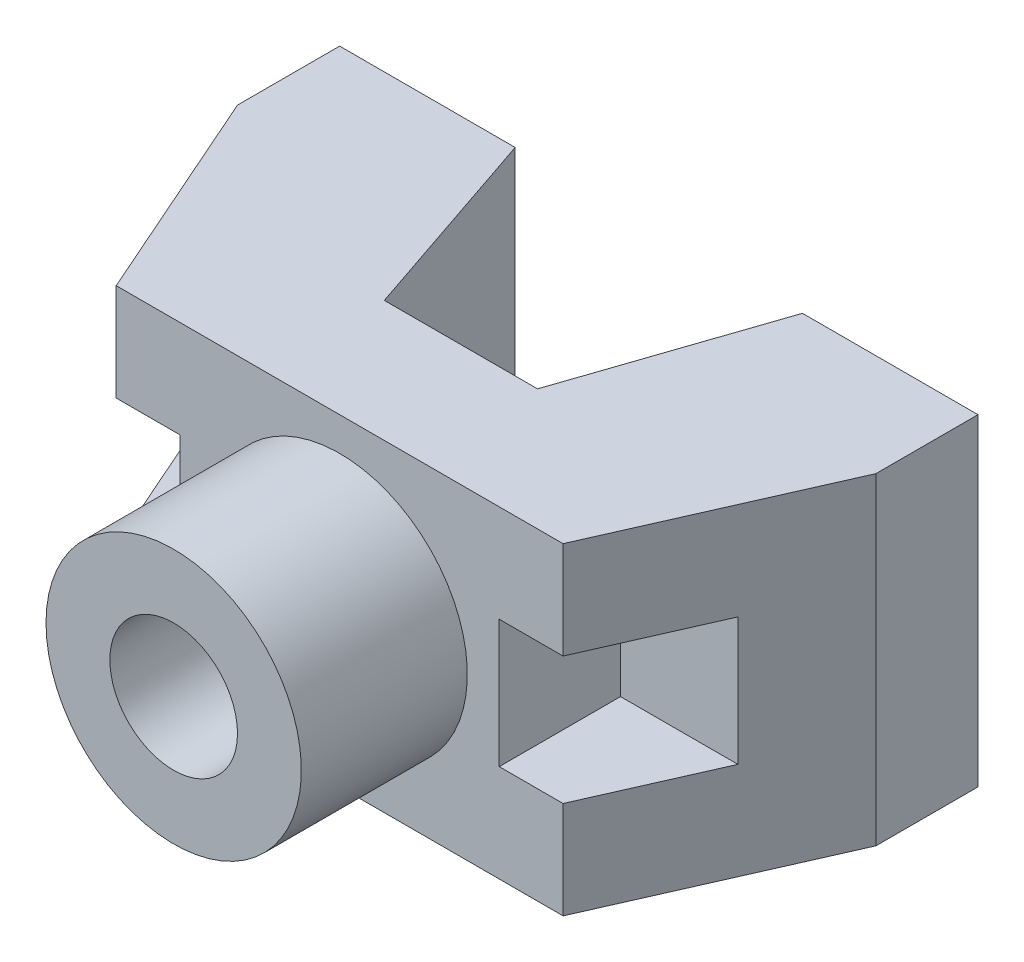
ISO-10303-21;
HEADER;
FILE_DESCRIPTION(('STEP AP214'),'2;1');
FILE_NAME('part.step','',(''),(''),'','','');
FILE_SCHEMA(('AUTOMOTIVE_DESIGN { 1 0 10303 214 1 1 1 1 }'));
ENDSEC;
DATA;
#1=APPLICATION_CONTEXT('core data for automotive mechanical design processes');
#2=APPLICATION_PROTOCOL_DEFINITION('international standard','automotive_design',2000,#1);
#3=PRODUCT_CONTEXT('',#1,'mechanical');
#4=PRODUCT('Part','Part','',(#3));
#5=PRODUCT_RELATED_PRODUCT_CATEGORY('part','',(#4));
#6=PRODUCT_DEFINITION_FORMATION('','',#4);
#7=PRODUCT_DEFINITION_CONTEXT('part definition',#1,'design');
#8=PRODUCT_DEFINITION('design','',#6,#7);
#9=PRODUCT_DEFINITION_SHAPE('','',#8);
#10=(LENGTH_UNIT() NAMED_UNIT(*) SI_UNIT(.MILLI.,.METRE.));
#11=(NAMED_UNIT(*) PLANE_ANGLE_UNIT() SI_UNIT($,.RADIAN.));
#12=(NAMED_UNIT(*) SI_UNIT($,.STERADIAN.) SOLID_ANGLE_UNIT());
#13=UNCERTAINTY_MEASURE_WITH_UNIT(LENGTH_MEASURE(1.E-05),#10,'distance_accuracy_value','');
#14=(GEOMETRIC_REPRESENTATION_CONTEXT(3) GLOBAL_UNCERTAINTY_ASSIGNED_CONTEXT((#13)) GLOBAL_UNIT_ASSIGNED_CONTEXT((#10,
#11,#12)) REPRESENTATION_CONTEXT('',''));
#15=CARTESIAN_POINT('',(0.,0.,0.));
#16=DIRECTION('',(0.,0.,1.));
#17=DIRECTION('',(1.,0.,0.));
#18=AXIS2_PLACEMENT_3D('',#15,#16,#17);
#19=CARTESIAN_POINT('',(0.,50.5,0.));
#20=DIRECTION('',(0.,0.,-1.));
#21=DIRECTION('',(-1.,0.,0.));
#22=AXIS2_PLACEMENT_3D('',#19,#20,#21);
#23=PLANE('',#22);
#24=CARTESIAN_POINT('',(35.,25.25,0.));
#25=DIRECTION('',(0.,0.,1.));
#26=DIRECTION('',(1.,0.,0.));
#27=AXIS2_PLACEMENT_3D('',#24,#25,#26);
#28=CIRCLE('',#27,20.);
#29=CARTESIAN_POINT('',(15.,25.25,0.));
#30=VERTEX_POINT('',#29);
#31=EDGE_CURVE('E223',#30,#30,#28,.T.);
#32=ORIENTED_EDGE('',*,*,#31,.F.);
#33=EDGE_LOOP('',(#32));
#34=FACE_BOUND('',#33,.T.);
#35=DIRECTION('',(1.,0.,0.));
#36=VECTOR('',#35,1.);
#37=CARTESIAN_POINT('',(10.,15.25,0.));
#38=LINE('',#37,#36);
#39=CARTESIAN_POINT('',(0.,15.25,0.));
#40=VERTEX_POINT('',#39);
#41=CARTESIAN_POINT('',(10.,15.25,0.));
#42=VERTEX_POINT('',#41);
#43=EDGE_CURVE('E206',#40,#42,#38,.T.);
#44=ORIENTED_EDGE('',*,*,#43,.F.);
#45=DIRECTION('',(0.,-1.,0.));
#46=VECTOR('',#45,1.);
#47=CARTESIAN_POINT('',(0.,50.5,0.));
#48=LINE('',#47,#46);
#49=CARTESIAN_POINT('',(0.,0.,0.));
#50=VERTEX_POINT('',#49);
#51=EDGE_CURVE('E282',#40,#50,#48,.T.);
#52=ORIENTED_EDGE('',*,*,#51,.T.);
#53=DIRECTION('',(1.,0.,0.));
#54=VECTOR('',#53,1.);
#55=CARTESIAN_POINT('',(0.,0.,0.));
#56=LINE('',#55,#54);
#57=CARTESIAN_POINT('',(70.,0.,0.));
#58=VERTEX_POINT('',#57);
#59=EDGE_CURVE('E277',#50,#58,#56,.T.);
#60=ORIENTED_EDGE('',*,*,#59,.T.);
#61=DIRECTION('',(0.,-1.,0.));
#62=VECTOR('',#61,1.);
#63=CARTESIAN_POINT('',(70.,50.5,0.));
#64=LINE('',#63,#62);
#65=CARTESIAN_POINT('',(70.,15.25,0.));
#66=VERTEX_POINT('',#65);
#67=EDGE_CURVE('E288',#66,#58,#64,.T.);
#68=ORIENTED_EDGE('',*,*,#67,.F.);
#69=DIRECTION('',(1.,0.,0.));
#70=VECTOR('',#69,1.);
#71=CARTESIAN_POINT('',(60.,15.25,0.));
#72=LINE('',#71,#70);
#73=CARTESIAN_POINT('',(60.,15.25,0.));
#74=VERTEX_POINT('',#73);
#75=EDGE_CURVE('E172',#74,#66,#72,.T.);
#76=ORIENTED_EDGE('',*,*,#75,.F.);
#77=DIRECTION('',(0.,-1.,0.));
#78=VECTOR('',#77,1.);
#79=CARTESIAN_POINT('',(60.,35.25,0.));
#80=LINE('',#79,#78);
#81=CARTESIAN_POINT('',(60.,35.25,0.));
#82=VERTEX_POINT('',#81);
#83=EDGE_CURVE('E195',#82,#74,#80,.T.);
#84=ORIENTED_EDGE('',*,*,#83,.F.);
#85=DIRECTION('',(-1.,0.,0.));
#86=VECTOR('',#85,1.);
#87=CARTESIAN_POINT('',(80.,35.25,0.));
#88=LINE('',#87,#86);
#89=CARTESIAN_POINT('',(70.,35.25,0.));
#90=VERTEX_POINT('',#89);
#91=EDGE_CURVE('E182',#90,#82,#88,.T.);
#92=ORIENTED_EDGE('',*,*,#91,.F.);
#93=CARTESIAN_POINT('',(70.,50.5,0.));
#94=VERTEX_POINT('',#93);
#95=EDGE_CURVE('E286',#94,#90,#64,.T.);
#96=ORIENTED_EDGE('',*,*,#95,.F.);
#97=DIRECTION('',(1.,0.,0.));
#98=VECTOR('',#97,1.);
#99=CARTESIAN_POINT('',(0.,50.5,0.));
#100=LINE('',#99,#98);
#101=CARTESIAN_POINT('',(0.,50.5,0.));
#102=VERTEX_POINT('',#101);
#103=EDGE_CURVE('E249',#102,#94,#100,.T.);
#104=ORIENTED_EDGE('',*,*,#103,.F.);
#105=CARTESIAN_POINT('',(0.,35.25,0.));
#106=VERTEX_POINT('',#105);
#107=EDGE_CURVE('E281',#102,#106,#48,.T.);
#108=ORIENTED_EDGE('',*,*,#107,.T.);
#109=DIRECTION('',(-1.,0.,0.));
#110=VECTOR('',#109,1.);
#111=CARTESIAN_POINT('',(-9.99999999999999,35.25,0.));
#112=LINE('',#111,#110);
#113=CARTESIAN_POINT('',(10.,35.25,0.));
#114=VERTEX_POINT('',#113);
#115=EDGE_CURVE('E205',#114,#106,#112,.T.);
#116=ORIENTED_EDGE('',*,*,#115,.F.);
#117=DIRECTION('',(0.,1.,0.));
#118=VECTOR('',#117,1.);
#119=CARTESIAN_POINT('',(10.,35.25,0.));
#120=LINE('',#119,#118);
#121=EDGE_CURVE('E192',#42,#114,#120,.T.);
#122=ORIENTED_EDGE('',*,*,#121,.F.);
#123=EDGE_LOOP('',(#44,#52,#60,#68,#76,#84,#92,#96,#104,#108,#116,#122));
#124=FACE_BOUND('',#123,.T.);
#125=ADVANCED_FACE('F41',(#34,#124),#23,.F.);
#126=CARTESIAN_POINT('',(-15.,50.5,-34.));
#127=DIRECTION('',(-1.,0.,0.));
#128=DIRECTION('',(0.,0.,1.));
#129=AXIS2_PLACEMENT_3D('',#126,#127,#128);
#130=PLANE('',#129);
#131=DIRECTION('',(0.,0.,-1.));
#132=VECTOR('',#131,1.);
#133=CARTESIAN_POINT('',(-15.,0.,-34.));
#134=LINE('',#133,#132);
#135=CARTESIAN_POINT('',(-15.,0.,-34.));
#136=VERTEX_POINT('',#135);
#137=CARTESIAN_POINT('',(-15.,0.,-50.));
#138=VERTEX_POINT('',#137);
#139=EDGE_CURVE('E221',#136,#138,#134,.T.);
#140=ORIENTED_EDGE('',*,*,#139,.F.);
#141=DIRECTION('',(0.,-1.,0.));
#142=VECTOR('',#141,1.);
#143=CARTESIAN_POINT('',(-15.,50.5,-34.));
#144=LINE('',#143,#142);
#145=CARTESIAN_POINT('',(-15.,50.5,-34.));
#146=VERTEX_POINT('',#145);
#147=EDGE_CURVE('E230',#146,#136,#144,.T.);
#148=ORIENTED_EDGE('',*,*,#147,.F.);
#149=DIRECTION('',(0.,0.,-1.));
#150=VECTOR('',#149,1.);
#151=CARTESIAN_POINT('',(-15.,50.5,-34.));
#152=LINE('',#151,#150);
#153=CARTESIAN_POINT('',(-15.,50.5,-50.));
#154=VERTEX_POINT('',#153);
#155=EDGE_CURVE('E228',#146,#154,#152,.T.);
#156=ORIENTED_EDGE('',*,*,#155,.T.);
#157=DIRECTION('',(0.,-1.,0.));
#158=VECTOR('',#157,1.);
#159=CARTESIAN_POINT('',(-15.,50.5,-50.));
#160=LINE('',#159,#158);
#161=EDGE_CURVE('E254',#154,#138,#160,.T.);
#162=ORIENTED_EDGE('',*,*,#161,.T.);
#163=EDGE_LOOP('',(#140,#148,#156,#162));
#164=FACE_BOUND('',#163,.T.);
#165=ADVANCED_FACE('F43',(#164),#130,.T.);
#166=CARTESIAN_POINT('',(0.,50.5,0.));
#167=DIRECTION('',(-0.914917801572932,0.,0.403640206576293));
#168=DIRECTION('',(0.403640206576294,0.,0.914917801572932));
#169=AXIS2_PLACEMENT_3D('',#166,#167,#168);
#170=PLANE('',#169);
#171=DIRECTION('',(-0.403640206576294,0.,-0.914917801572932));
#172=VECTOR('',#171,1.);
#173=CARTESIAN_POINT('',(0.,35.25,0.));
#174=LINE('',#173,#172);
#175=CARTESIAN_POINT('',(-8.38235294117647,35.25,-19.));
#176=VERTEX_POINT('',#175);
#177=EDGE_CURVE('E11',#106,#176,#174,.T.);
#178=ORIENTED_EDGE('',*,*,#177,.F.);
#179=ORIENTED_EDGE('',*,*,#107,.F.);
#180=DIRECTION('',(-0.403640206576294,0.,-0.914917801572932));
#181=VECTOR('',#180,1.);
#182=CARTESIAN_POINT('',(0.,50.5,0.));
#183=LINE('',#182,#181);
#184=EDGE_CURVE('E252',#102,#146,#183,.T.);
#185=ORIENTED_EDGE('',*,*,#184,.T.);
#186=ORIENTED_EDGE('',*,*,#147,.T.);
#187=DIRECTION('',(-0.403640206576294,0.,-0.914917801572932));
#188=VECTOR('',#187,1.);
#189=CARTESIAN_POINT('',(0.,0.,0.));
#190=LINE('',#189,#188);
#191=EDGE_CURVE('E232',#50,#136,#190,.T.);
#192=ORIENTED_EDGE('',*,*,#191,.F.);
#193=ORIENTED_EDGE('',*,*,#51,.F.);
#194=DIRECTION('',(0.403640206576294,0.,0.914917801572932));
#195=VECTOR('',#194,1.);
#196=CARTESIAN_POINT('',(0.,15.25,0.));
#197=LINE('',#196,#195);
#198=CARTESIAN_POINT('',(-8.38235294117647,15.25,-19.));
#199=VERTEX_POINT('',#198);
#200=EDGE_CURVE('E47',#199,#40,#197,.T.);
#201=ORIENTED_EDGE('',*,*,#200,.F.);
#202=DIRECTION('',(0.,-1.,0.));
#203=VECTOR('',#202,1.);
#204=CARTESIAN_POINT('',(-8.38235294117647,50.5,-19.));
#205=LINE('',#204,#203);
#206=EDGE_CURVE('E208',#176,#199,#205,.T.);
#207=ORIENTED_EDGE('',*,*,#206,.F.);
#208=EDGE_LOOP('',(#178,#179,#185,#186,#192,#193,#201,#207));
#209=FACE_BOUND('',#208,.T.);
#210=ADVANCED_FACE('F324',(#209),#170,.T.);
#211=CARTESIAN_POINT('',(70.,50.5,0.));
#212=DIRECTION('',(-0.914917801572932,0.,-0.403640206576293));
#213=DIRECTION('',(-0.403640206576294,0.,0.914917801572932));
#214=AXIS2_PLACEMENT_3D('',#211,#212,#213);
#215=PLANE('',#214);
#216=DIRECTION('',(0.,1.,0.));
#217=VECTOR('',#216,1.);
#218=CARTESIAN_POINT('',(78.3823529411765,50.5,-19.));
#219=LINE('',#218,#217);
#220=CARTESIAN_POINT('',(78.3823529411765,15.25,-19.));
#221=VERTEX_POINT('',#220);
#222=CARTESIAN_POINT('',(78.3823529411765,35.25,-19.));
#223=VERTEX_POINT('',#222);
#224=EDGE_CURVE('E171',#221,#223,#219,.T.);
#225=ORIENTED_EDGE('',*,*,#224,.F.);
#226=DIRECTION('',(-0.403640206576294,0.,0.914917801572932));
#227=VECTOR('',#226,1.);
#228=CARTESIAN_POINT('',(70.,15.25,0.));
#229=LINE('',#228,#227);
#230=EDGE_CURVE('E207',#221,#66,#229,.T.);
#231=ORIENTED_EDGE('',*,*,#230,.T.);
#232=ORIENTED_EDGE('',*,*,#67,.T.);
#233=DIRECTION('',(0.403640206576294,0.,-0.914917801572932));
#234=VECTOR('',#233,1.);
#235=CARTESIAN_POINT('',(70.,0.,0.));
#236=LINE('',#235,#234);
#237=CARTESIAN_POINT('',(85.,0.,-34.));
#238=VERTEX_POINT('',#237);
#239=EDGE_CURVE('E273',#58,#238,#236,.T.);
#240=ORIENTED_EDGE('',*,*,#239,.T.);
#241=DIRECTION('',(0.,-1.,0.));
#242=VECTOR('',#241,1.);
#243=CARTESIAN_POINT('',(85.,50.5,-34.));
#244=LINE('',#243,#242);
#245=CARTESIAN_POINT('',(85.,50.5,-34.));
#246=VERTEX_POINT('',#245);
#247=EDGE_CURVE('E289',#246,#238,#244,.T.);
#248=ORIENTED_EDGE('',*,*,#247,.F.);
#249=DIRECTION('',(0.403640206576294,0.,-0.914917801572932));
#250=VECTOR('',#249,1.);
#251=CARTESIAN_POINT('',(70.,50.5,0.));
#252=LINE('',#251,#250);
#253=EDGE_CURVE('E247',#94,#246,#252,.T.);
#254=ORIENTED_EDGE('',*,*,#253,.F.);
#255=ORIENTED_EDGE('',*,*,#95,.T.);
#256=DIRECTION('',(0.403640206576294,0.,-0.914917801572932));
#257=VECTOR('',#256,1.);
#258=CARTESIAN_POINT('',(70.,35.25,0.));
#259=LINE('',#258,#257);
#260=EDGE_CURVE('E307',#90,#223,#259,.T.);
#261=ORIENTED_EDGE('',*,*,#260,.T.);
#262=EDGE_LOOP('',(#225,#231,#232,#240,#248,#254,#255,#261));
#263=FACE_BOUND('',#262,.T.);
#264=ADVANCED_FACE('F331',(#263),#215,.F.);
#265=CARTESIAN_POINT('',(85.,50.5,-34.));
#266=DIRECTION('',(-1.,0.,0.));
#267=DIRECTION('',(0.,0.,1.));
#268=AXIS2_PLACEMENT_3D('',#265,#266,#267);
#269=PLANE('',#268);
#270=DIRECTION('',(0.,0.,-1.));
#271=VECTOR('',#270,1.);
#272=CARTESIAN_POINT('',(85.,0.,-34.));
#273=LINE('',#272,#271);
#274=CARTESIAN_POINT('',(85.,0.,-50.));
#275=VERTEX_POINT('',#274);
#276=EDGE_CURVE('E275',#238,#275,#273,.T.);
#277=ORIENTED_EDGE('',*,*,#276,.T.);
#278=DIRECTION('',(0.,-1.,0.));
#279=VECTOR('',#278,1.);
#280=CARTESIAN_POINT('',(85.,50.5,-50.));
#281=LINE('',#280,#279);
#282=CARTESIAN_POINT('',(85.,50.5,-50.));
#283=VERTEX_POINT('',#282);
#284=EDGE_CURVE('E291',#283,#275,#281,.T.);
#285=ORIENTED_EDGE('',*,*,#284,.F.);
#286=DIRECTION('',(0.,0.,-1.));
#287=VECTOR('',#286,1.);
#288=CARTESIAN_POINT('',(85.,50.5,-34.));
#289=LINE('',#288,#287);
#290=EDGE_CURVE('E246',#246,#283,#289,.T.);
#291=ORIENTED_EDGE('',*,*,#290,.F.);
#292=ORIENTED_EDGE('',*,*,#247,.T.);
#293=EDGE_LOOP('',(#277,#285,#291,#292));
#294=FACE_BOUND('',#293,.T.);
#295=ADVANCED_FACE('F376',(#294),#269,.F.);
#296=CARTESIAN_POINT('',(85.,50.5,-50.));
#297=DIRECTION('',(0.,0.,1.));
#298=DIRECTION('',(1.,0.,0.));
#299=AXIS2_PLACEMENT_3D('',#296,#297,#298);
#300=PLANE('',#299);
#301=DIRECTION('',(-1.,0.,0.));
#302=VECTOR('',#301,1.);
#303=CARTESIAN_POINT('',(85.,0.,-50.));
#304=LINE('',#303,#302);
#305=CARTESIAN_POINT('',(57.5,0.,-50.));
#306=VERTEX_POINT('',#305);
#307=EDGE_CURVE('E269',#275,#306,#304,.T.);
#308=ORIENTED_EDGE('',*,*,#307,.T.);
#309=DIRECTION('',(0.,-1.,0.));
#310=VECTOR('',#309,1.);
#311=CARTESIAN_POINT('',(57.5,50.5,-50.));
#312=LINE('',#311,#310);
#313=CARTESIAN_POINT('',(57.5,50.5,-50.));
#314=VERTEX_POINT('',#313);
#315=EDGE_CURVE('E299',#314,#306,#312,.T.);
#316=ORIENTED_EDGE('',*,*,#315,.F.);
#317=DIRECTION('',(-1.,0.,0.));
#318=VECTOR('',#317,1.);
#319=CARTESIAN_POINT('',(85.,50.5,-50.));
#320=LINE('',#319,#318);
#321=EDGE_CURVE('E243',#283,#314,#320,.T.);
#322=ORIENTED_EDGE('',*,*,#321,.F.);
#323=ORIENTED_EDGE('',*,*,#284,.T.);
#324=EDGE_LOOP('',(#308,#316,#322,#323));
#325=FACE_BOUND('',#324,.T.);
#326=ADVANCED_FACE('F377',(#325),#300,.F.);
#327=CARTESIAN_POINT('',(57.5,50.5,-50.));
#328=DIRECTION('',(0.947144575627813,0.,0.320807033680389));
#329=DIRECTION('',(0.320807033680389,0.,-0.947144575627813));
#330=AXIS2_PLACEMENT_3D('',#327,#328,#329);
#331=PLANE('',#330);
#332=DIRECTION('',(-0.320807033680389,0.,0.947144575627813));
#333=VECTOR('',#332,1.);
#334=CARTESIAN_POINT('',(57.5,0.,-50.));
#335=LINE('',#334,#333);
#336=CARTESIAN_POINT('',(47.,0.,-19.));
#337=VERTEX_POINT('',#336);
#338=EDGE_CURVE('E270',#306,#337,#335,.T.);
#339=ORIENTED_EDGE('',*,*,#338,.T.);
#340=DIRECTION('',(0.,-1.,0.));
#341=VECTOR('',#340,1.);
#342=CARTESIAN_POINT('',(47.,50.5,-19.));
#343=LINE('',#342,#341);
#344=CARTESIAN_POINT('',(47.,50.5,-19.));
#345=VERTEX_POINT('',#344);
#346=EDGE_CURVE('E298',#345,#337,#343,.T.);
#347=ORIENTED_EDGE('',*,*,#346,.F.);
#348=DIRECTION('',(-0.320807033680389,0.,0.947144575627813));
#349=VECTOR('',#348,1.);
#350=CARTESIAN_POINT('',(57.5,50.5,-50.));
#351=LINE('',#350,#349);
#352=EDGE_CURVE('E241',#314,#345,#351,.T.);
#353=ORIENTED_EDGE('',*,*,#352,.F.);
#354=ORIENTED_EDGE('',*,*,#315,.T.);
#355=EDGE_LOOP('',(#339,#347,#353,#354));
#356=FACE_BOUND('',#355,.T.);
#357=ADVANCED_FACE('F382',(#356),#331,.F.);
#358=CARTESIAN_POINT('',(23.,50.5,-19.));
#359=DIRECTION('',(0.,0.,-1.));
#360=DIRECTION('',(-1.,0.,0.));
#361=AXIS2_PLACEMENT_3D('',#358,#359,#360);
#362=PLANE('',#361);
#363=DIRECTION('',(1.,0.,0.));
#364=VECTOR('',#363,1.);
#365=CARTESIAN_POINT('',(23.,0.,-19.));
#366=LINE('',#365,#364);
#367=CARTESIAN_POINT('',(23.,0.,-19.));
#368=VERTEX_POINT('',#367);
#369=EDGE_CURVE('E262',#368,#337,#366,.T.);
#370=ORIENTED_EDGE('',*,*,#369,.F.);
#371=DIRECTION('',(0.,-1.,0.));
#372=VECTOR('',#371,1.);
#373=CARTESIAN_POINT('',(23.,50.5,-19.));
#374=LINE('',#373,#372);
#375=CARTESIAN_POINT('',(23.,50.5,-19.));
#376=VERTEX_POINT('',#375);
#377=EDGE_CURVE('E301',#376,#368,#374,.T.);
#378=ORIENTED_EDGE('',*,*,#377,.F.);
#379=DIRECTION('',(1.,0.,0.));
#380=VECTOR('',#379,1.);
#381=CARTESIAN_POINT('',(23.,50.5,-19.));
#382=LINE('',#381,#380);
#383=EDGE_CURVE('E239',#376,#345,#382,.T.);
#384=ORIENTED_EDGE('',*,*,#383,.T.);
#385=ORIENTED_EDGE('',*,*,#346,.T.);
#386=EDGE_LOOP('',(#370,#378,#384,#385));
#387=FACE_BOUND('',#386,.T.);
#388=ADVANCED_FACE('F390',(#387),#362,.T.);
#389=CARTESIAN_POINT('',(12.5,50.5,-50.));
#390=DIRECTION('',(0.947144575627813,0.,-0.320807033680388));
#391=DIRECTION('',(-0.320807033680388,0.,-0.947144575627813));
#392=AXIS2_PLACEMENT_3D('',#389,#390,#391);
#393=PLANE('',#392);
#394=DIRECTION('',(0.320807033680388,0.,0.947144575627813));
#395=VECTOR('',#394,1.);
#396=CARTESIAN_POINT('',(12.5,0.,-50.));
#397=LINE('',#396,#395);
#398=CARTESIAN_POINT('',(12.5,0.,-50.));
#399=VERTEX_POINT('',#398);
#400=EDGE_CURVE('E261',#399,#368,#397,.T.);
#401=ORIENTED_EDGE('',*,*,#400,.F.);
#402=DIRECTION('',(0.,-1.,0.));
#403=VECTOR('',#402,1.);
#404=CARTESIAN_POINT('',(12.5,50.5,-50.));
#405=LINE('',#404,#403);
#406=CARTESIAN_POINT('',(12.5,50.5,-50.));
#407=VERTEX_POINT('',#406);
#408=EDGE_CURVE('E302',#407,#399,#405,.T.);
#409=ORIENTED_EDGE('',*,*,#408,.F.);
#410=DIRECTION('',(0.320807033680388,0.,0.947144575627813));
#411=VECTOR('',#410,1.);
#412=CARTESIAN_POINT('',(12.5,50.5,-50.));
#413=LINE('',#412,#411);
#414=EDGE_CURVE('E237',#407,#376,#413,.T.);
#415=ORIENTED_EDGE('',*,*,#414,.T.);
#416=ORIENTED_EDGE('',*,*,#377,.T.);
#417=EDGE_LOOP('',(#401,#409,#415,#416));
#418=FACE_BOUND('',#417,.T.);
#419=ADVANCED_FACE('F394',(#418),#393,.T.);
#420=CARTESIAN_POINT('',(-15.,50.5,-50.));
#421=DIRECTION('',(0.,0.,-1.));
#422=DIRECTION('',(-1.,0.,0.));
#423=AXIS2_PLACEMENT_3D('',#420,#421,#422);
#424=PLANE('',#423);
#425=DIRECTION('',(1.,0.,0.));
#426=VECTOR('',#425,1.);
#427=CARTESIAN_POINT('',(-15.,0.,-50.));
#428=LINE('',#427,#426);
#429=EDGE_CURVE('E256',#138,#399,#428,.T.);
#430=ORIENTED_EDGE('',*,*,#429,.F.);
#431=ORIENTED_EDGE('',*,*,#161,.F.);
#432=DIRECTION('',(1.,0.,0.));
#433=VECTOR('',#432,1.);
#434=CARTESIAN_POINT('',(-15.,50.5,-50.));
#435=LINE('',#434,#433);
#436=EDGE_CURVE('E235',#154,#407,#435,.T.);
#437=ORIENTED_EDGE('',*,*,#436,.T.);
#438=ORIENTED_EDGE('',*,*,#408,.T.);
#439=EDGE_LOOP('',(#430,#431,#437,#438));
#440=FACE_BOUND('',#439,.T.);
#441=ADVANCED_FACE('F393',(#440),#424,.T.);
#442=CARTESIAN_POINT('',(0.,50.5,0.));
#443=DIRECTION('',(0.,-1.,0.));
#444=DIRECTION('',(0.,0.,-1.));
#445=AXIS2_PLACEMENT_3D('',#442,#443,#444);
#446=PLANE('',#445);
#447=ORIENTED_EDGE('',*,*,#155,.F.);
#448=ORIENTED_EDGE('',*,*,#184,.F.);
#449=ORIENTED_EDGE('',*,*,#103,.T.);
#450=ORIENTED_EDGE('',*,*,#253,.T.);
#451=ORIENTED_EDGE('',*,*,#290,.T.);
#452=ORIENTED_EDGE('',*,*,#321,.T.);
#453=ORIENTED_EDGE('',*,*,#352,.T.);
#454=ORIENTED_EDGE('',*,*,#383,.F.);
#455=ORIENTED_EDGE('',*,*,#414,.F.);
#456=ORIENTED_EDGE('',*,*,#436,.F.);
#457=EDGE_LOOP('',(#447,#448,#449,#450,#451,#452,#453,#454,#455,#456));
#458=FACE_BOUND('',#457,.T.);
#459=ADVANCED_FACE('F343',(#458),#446,.F.);
#460=CARTESIAN_POINT('',(0.,0.,0.));
#461=DIRECTION('',(0.,-1.,0.));
#462=DIRECTION('',(0.,0.,-1.));
#463=AXIS2_PLACEMENT_3D('',#460,#461,#462);
#464=PLANE('',#463);
#465=ORIENTED_EDGE('',*,*,#139,.T.);
#466=ORIENTED_EDGE('',*,*,#429,.T.);
#467=ORIENTED_EDGE('',*,*,#400,.T.);
#468=ORIENTED_EDGE('',*,*,#369,.T.);
#469=ORIENTED_EDGE('',*,*,#338,.F.);
#470=ORIENTED_EDGE('',*,*,#307,.F.);
#471=ORIENTED_EDGE('',*,*,#276,.F.);
#472=ORIENTED_EDGE('',*,*,#239,.F.);
#473=ORIENTED_EDGE('',*,*,#59,.F.);
#474=ORIENTED_EDGE('',*,*,#191,.T.);
#475=EDGE_LOOP('',(#465,#466,#467,#468,#469,#470,#471,#472,#473,#474));
#476=FACE_BOUND('',#475,.T.);
#477=ADVANCED_FACE('F327',(#476),#464,.T.);
#478=CARTESIAN_POINT('',(35.,25.25,26.));
#479=DIRECTION('',(0.,0.,-1.));
#480=DIRECTION('',(-1.,0.,0.));
#481=AXIS2_PLACEMENT_3D('',#478,#479,#480);
#482=CYLINDRICAL_SURFACE('',#481,20.);
#483=CARTESIAN_POINT('',(35.,25.25,26.));
#484=DIRECTION('',(0.,0.,1.));
#485=DIRECTION('',(1.,0.,0.));
#486=AXIS2_PLACEMENT_3D('',#483,#484,#485);
#487=CIRCLE('',#486,20.);
#488=CARTESIAN_POINT('',(15.,25.25,26.));
#489=VERTEX_POINT('',#488);
#490=EDGE_CURVE('E218',#489,#489,#487,.T.);
#491=CARTESIAN_POINT('',(15.,25.25,26.));
#492=CARTESIAN_POINT('',(15.,25.25,25.7291666666667));
#493=CARTESIAN_POINT('',(15.,25.25,25.4583333333333));
#494=CARTESIAN_POINT('',(15.,25.25,24.9166666666667));
#495=CARTESIAN_POINT('',(15.,25.25,24.6458333333333));
#496=CARTESIAN_POINT('',(15.,25.25,24.1041666666667));
#497=CARTESIAN_POINT('',(15.,25.25,23.8333333333333));
#498=CARTESIAN_POINT('',(15.,25.25,23.2916666666667));
#499=CARTESIAN_POINT('',(15.,25.25,23.0208333333333));
#500=CARTESIAN_POINT('',(15.,25.25,22.4791666666667));
#501=CARTESIAN_POINT('',(15.,25.25,22.2083333333333));
#502=CARTESIAN_POINT('',(15.,25.25,21.6666666666667));
#503=CARTESIAN_POINT('',(15.,25.25,21.3958333333333));
#504=CARTESIAN_POINT('',(15.,25.25,20.8541666666667));
#505=CARTESIAN_POINT('',(15.,25.25,20.5833333333333));
#506=CARTESIAN_POINT('',(15.,25.25,20.0416666666667));
#507=CARTESIAN_POINT('',(15.,25.25,19.7708333333333));
#508=CARTESIAN_POINT('',(15.,25.25,19.2291666666667));
#509=CARTESIAN_POINT('',(15.,25.25,18.9583333333333));
#510=CARTESIAN_POINT('',(15.,25.25,18.4166666666667));
#511=CARTESIAN_POINT('',(15.,25.25,18.1458333333333));
#512=CARTESIAN_POINT('',(15.,25.25,17.6041666666667));
#513=CARTESIAN_POINT('',(15.,25.25,17.3333333333333));
#514=CARTESIAN_POINT('',(15.,25.25,16.7916666666667));
#515=CARTESIAN_POINT('',(15.,25.25,16.5208333333333));
#516=CARTESIAN_POINT('',(15.,25.25,15.9791666666667));
#517=CARTESIAN_POINT('',(15.,25.25,15.7083333333333));
#518=CARTESIAN_POINT('',(15.,25.25,15.1666666666667));
#519=CARTESIAN_POINT('',(15.,25.25,14.8958333333333));
#520=CARTESIAN_POINT('',(15.,25.25,14.3541666666667));
#521=CARTESIAN_POINT('',(15.,25.25,14.0833333333333));
#522=CARTESIAN_POINT('',(15.,25.25,13.5416666666667));
#523=CARTESIAN_POINT('',(15.,25.25,13.2708333333333));
#524=CARTESIAN_POINT('',(15.,25.25,12.7291666666667));
#525=CARTESIAN_POINT('',(15.,25.25,12.4583333333333));
#526=CARTESIAN_POINT('',(15.,25.25,11.9166666666667));
#527=CARTESIAN_POINT('',(15.,25.25,11.6458333333333));
#528=CARTESIAN_POINT('',(15.,25.25,11.1041666666667));
#529=CARTESIAN_POINT('',(15.,25.25,10.8333333333333));
#530=CARTESIAN_POINT('',(15.,25.25,10.2916666666667));
#531=CARTESIAN_POINT('',(15.,25.25,10.0208333333333));
#532=CARTESIAN_POINT('',(15.,25.25,9.47916666666667));
#533=CARTESIAN_POINT('',(15.,25.25,9.20833333333333));
#534=CARTESIAN_POINT('',(15.,25.25,8.66666666666667));
#535=CARTESIAN_POINT('',(15.,25.25,8.39583333333333));
#536=CARTESIAN_POINT('',(15.,25.25,7.85416666666667));
#537=CARTESIAN_POINT('',(15.,25.25,7.58333333333333));
#538=CARTESIAN_POINT('',(15.,25.25,7.04166666666667));
#539=CARTESIAN_POINT('',(15.,25.25,6.77083333333333));
#540=CARTESIAN_POINT('',(15.,25.25,6.22916666666667));
#541=CARTESIAN_POINT('',(15.,25.25,5.95833333333333));
#542=CARTESIAN_POINT('',(15.,25.25,5.41666666666667));
#543=CARTESIAN_POINT('',(15.,25.25,5.14583333333333));
#544=CARTESIAN_POINT('',(15.,25.25,4.60416666666667));
#545=CARTESIAN_POINT('',(15.,25.25,4.33333333333333));
#546=CARTESIAN_POINT('',(15.,25.25,3.79166666666667));
#547=CARTESIAN_POINT('',(15.,25.25,3.52083333333333));
#548=CARTESIAN_POINT('',(15.,25.25,2.97916666666667));
#549=CARTESIAN_POINT('',(15.,25.25,2.70833333333333));
#550=CARTESIAN_POINT('',(15.,25.25,2.16666666666667));
#551=CARTESIAN_POINT('',(15.,25.25,1.89583333333333));
#552=CARTESIAN_POINT('',(15.,25.25,1.35416666666667));
#553=CARTESIAN_POINT('',(15.,25.25,1.08333333333333));
#554=CARTESIAN_POINT('',(15.,25.25,0.541666666666667));
#555=CARTESIAN_POINT('',(15.,25.25,0.270833333333334));
#556=CARTESIAN_POINT('',(15.,25.25,0.));
#557=B_SPLINE_CURVE_WITH_KNOTS('',3,(#491,#492,#493,#494,#495,#496,#497,#498,#499,#500,#501,
#502,#503,#504,#505,#506,#507,#508,#509,#510,#511,#512,#513,#514,#515,#516,#517,#518,#519,#520,
#521,#522,#523,#524,#525,#526,#527,#528,#529,#530,#531,#532,#533,#534,#535,#536,#537,#538,#539,
#540,#541,#542,#543,#544,#545,#546,#547,#548,#549,#550,#551,#552,#553,#554,#555,#556),
.UNSPECIFIED.,.F.,.F.,(4,2,2,2,2,2,2,2,2,2,2,2,2,2,2,2,2,2,2,2,2,2,2,2,2,2,2,2,2,2,2,2,4),(0.,
0.812500000000001,1.625,2.4375,3.25,4.0625,4.875,5.6875,6.5,7.3125,8.125,8.9375,9.75,10.5625,
11.375,12.1875,13.,13.8125,14.625,15.4375,16.25,17.0625,17.875,18.6875,19.5,20.3125,21.125,
21.9375,22.75,23.5625,24.375,25.1875,26.),.UNSPECIFIED.);
#558=EDGE_CURVE('BSEAM417',#489,#30,#557,.T.);
#559=ORIENTED_EDGE('',*,*,#490,.F.);
#560=ORIENTED_EDGE('',*,*,#31,.T.);
#561=ORIENTED_EDGE('',*,*,#558,.T.);
#562=ORIENTED_EDGE('',*,*,#558,.F.);
#563=EDGE_LOOP('',(#559,#561,#560,#562));
#564=FACE_BOUND('',#563,.T.);
#565=ADVANCED_FACE('F417',(#564),#482,.T.);
#566=CARTESIAN_POINT('',(35.,25.25,26.));
#567=DIRECTION('',(0.,0.,1.));
#568=DIRECTION('',(1.,0.,0.));
#569=AXIS2_PLACEMENT_3D('',#566,#567,#568);
#570=PLANE('',#569);
#571=CARTESIAN_POINT('',(35.,25.25,26.));
#572=DIRECTION('',(0.,0.,1.));
#573=DIRECTION('',(1.,0.,0.));
#574=AXIS2_PLACEMENT_3D('',#571,#572,#573);
#575=CIRCLE('',#574,10.);
#576=CARTESIAN_POINT('',(45.,25.25,26.));
#577=VERTEX_POINT('',#576);
#578=EDGE_CURVE('E198',#577,#577,#575,.T.);
#579=ORIENTED_EDGE('',*,*,#578,.F.);
#580=EDGE_LOOP('',(#579));
#581=FACE_BOUND('',#580,.T.);
#582=ORIENTED_EDGE('',*,*,#490,.T.);
#583=EDGE_LOOP('',(#582));
#584=FACE_BOUND('',#583,.T.);
#585=ADVANCED_FACE('F423',(#581,#584),#570,.T.);
#586=CARTESIAN_POINT('',(35.,25.25,0.));
#587=DIRECTION('',(0.,0.,1.));
#588=DIRECTION('',(1.,0.,0.));
#589=AXIS2_PLACEMENT_3D('',#586,#587,#588);
#590=CYLINDRICAL_SURFACE('',#589,10.);
#591=CARTESIAN_POINT('',(35.,25.25,0.));
#592=DIRECTION('',(0.,0.,1.));
#593=DIRECTION('',(1.,0.,0.));
#594=AXIS2_PLACEMENT_3D('',#591,#592,#593);
#595=CIRCLE('',#594,10.);
#596=CARTESIAN_POINT('',(45.,25.25,0.));
#597=VERTEX_POINT('',#596);
#598=EDGE_CURVE('E216',#597,#597,#595,.T.);
#599=CARTESIAN_POINT('',(45.,25.25,0.));
#600=CARTESIAN_POINT('',(45.,25.25,0.270833333333333));
#601=CARTESIAN_POINT('',(45.,25.25,0.541666666666667));
#602=CARTESIAN_POINT('',(45.,25.25,1.08333333333333));
#603=CARTESIAN_POINT('',(45.,25.25,1.35416666666667));
#604=CARTESIAN_POINT('',(45.,25.25,1.89583333333333));
#605=CARTESIAN_POINT('',(45.,25.25,2.16666666666667));
#606=CARTESIAN_POINT('',(45.,25.25,2.70833333333333));
#607=CARTESIAN_POINT('',(45.,25.25,2.97916666666667));
#608=CARTESIAN_POINT('',(45.,25.25,3.52083333333333));
#609=CARTESIAN_POINT('',(45.,25.25,3.79166666666667));
#610=CARTESIAN_POINT('',(45.,25.25,4.33333333333333));
#611=CARTESIAN_POINT('',(45.,25.25,4.60416666666667));
#612=CARTESIAN_POINT('',(45.,25.25,5.14583333333333));
#613=CARTESIAN_POINT('',(45.,25.25,5.41666666666667));
#614=CARTESIAN_POINT('',(45.,25.25,5.95833333333333));
#615=CARTESIAN_POINT('',(45.,25.25,6.22916666666667));
#616=CARTESIAN_POINT('',(45.,25.25,6.77083333333333));
#617=CARTESIAN_POINT('',(45.,25.25,7.04166666666667));
#618=CARTESIAN_POINT('',(45.,25.25,7.58333333333333));
#619=CARTESIAN_POINT('',(45.,25.25,7.85416666666667));
#620=CARTESIAN_POINT('',(45.,25.25,8.39583333333333));
#621=CARTESIAN_POINT('',(45.,25.25,8.66666666666667));
#622=CARTESIAN_POINT('',(45.,25.25,9.20833333333333));
#623=CARTESIAN_POINT('',(45.,25.25,9.47916666666667));
#624=CARTESIAN_POINT('',(45.,25.25,10.0208333333333));
#625=CARTESIAN_POINT('',(45.,25.25,10.2916666666667));
#626=CARTESIAN_POINT('',(45.,25.25,10.8333333333333));
#627=CARTESIAN_POINT('',(45.,25.25,11.1041666666667));
#628=CARTESIAN_POINT('',(45.,25.25,11.6458333333333));
#629=CARTESIAN_POINT('',(45.,25.25,11.9166666666667));
#630=CARTESIAN_POINT('',(45.,25.25,12.4583333333333));
#631=CARTESIAN_POINT('',(45.,25.25,12.7291666666667));
#632=CARTESIAN_POINT('',(45.,25.25,13.2708333333333));
#633=CARTESIAN_POINT('',(45.,25.25,13.5416666666667));
#634=CARTESIAN_POINT('',(45.,25.25,14.0833333333333));
#635=CARTESIAN_POINT('',(45.,25.25,14.3541666666667));
#636=CARTESIAN_POINT('',(45.,25.25,14.8958333333333));
#637=CARTESIAN_POINT('',(45.,25.25,15.1666666666667));
#638=CARTESIAN_POINT('',(45.,25.25,15.7083333333333));
#639=CARTESIAN_POINT('',(45.,25.25,15.9791666666667));
#640=CARTESIAN_POINT('',(45.,25.25,16.5208333333333));
#641=CARTESIAN_POINT('',(45.,25.25,16.7916666666667));
#642=CARTESIAN_POINT('',(45.,25.25,17.3333333333333));
#643=CARTESIAN_POINT('',(45.,25.25,17.6041666666667));
#644=CARTESIAN_POINT('',(45.,25.25,18.1458333333333));
#645=CARTESIAN_POINT('',(45.,25.25,18.4166666666667));
#646=CARTESIAN_POINT('',(45.,25.25,18.9583333333333));
#647=CARTESIAN_POINT('',(45.,25.25,19.2291666666667));
#648=CARTESIAN_POINT('',(45.,25.25,19.7708333333333));
#649=CARTESIAN_POINT('',(45.,25.25,20.0416666666667));
#650=CARTESIAN_POINT('',(45.,25.25,20.5833333333333));
#651=CARTESIAN_POINT('',(45.,25.25,20.8541666666667));
#652=CARTESIAN_POINT('',(45.,25.25,21.3958333333333));
#653=CARTESIAN_POINT('',(45.,25.25,21.6666666666667));
#654=CARTESIAN_POINT('',(45.,25.25,22.2083333333333));
#655=CARTESIAN_POINT('',(45.,25.25,22.4791666666667));
#656=CARTESIAN_POINT('',(45.,25.25,23.0208333333333));
#657=CARTESIAN_POINT('',(45.,25.25,23.2916666666667));
#658=CARTESIAN_POINT('',(45.,25.25,23.8333333333333));
#659=CARTESIAN_POINT('',(45.,25.25,24.1041666666667));
#660=CARTESIAN_POINT('',(45.,25.25,24.6458333333333));
#661=CARTESIAN_POINT('',(45.,25.25,24.9166666666667));
#662=CARTESIAN_POINT('',(45.,25.25,25.4583333333333));
#663=CARTESIAN_POINT('',(45.,25.25,25.7291666666667));
#664=CARTESIAN_POINT('',(45.,25.25,26.));
#665=B_SPLINE_CURVE_WITH_KNOTS('',3,(#599,#600,#601,#602,#603,#604,#605,#606,#607,#608,#609,
#610,#611,#612,#613,#614,#615,#616,#617,#618,#619,#620,#621,#622,#623,#624,#625,#626,#627,#628,
#629,#630,#631,#632,#633,#634,#635,#636,#637,#638,#639,#640,#641,#642,#643,#644,#645,#646,#647,
#648,#649,#650,#651,#652,#653,#654,#655,#656,#657,#658,#659,#660,#661,#662,#663,#664),
.UNSPECIFIED.,.F.,.F.,(4,2,2,2,2,2,2,2,2,2,2,2,2,2,2,2,2,2,2,2,2,2,2,2,2,2,2,2,2,2,2,2,4),(0.,
0.8125,1.625,2.4375,3.25,4.0625,4.875,5.6875,6.5,7.3125,8.125,8.9375,9.75,10.5625,11.375,
12.1875,13.,13.8125,14.625,15.4375,16.25,17.0625,17.875,18.6875,19.5,20.3125,21.125,21.9375,
22.75,23.5625,24.375,25.1875,26.),.UNSPECIFIED.);
#666=EDGE_CURVE('BSEAM422',#597,#577,#665,.T.);
#667=ORIENTED_EDGE('',*,*,#598,.F.);
#668=ORIENTED_EDGE('',*,*,#578,.T.);
#669=ORIENTED_EDGE('',*,*,#666,.T.);
#670=ORIENTED_EDGE('',*,*,#666,.F.);
#671=EDGE_LOOP('',(#667,#669,#668,#670));
#672=FACE_BOUND('',#671,.T.);
#673=ADVANCED_FACE('F422',(#672),#590,.F.);
#674=CARTESIAN_POINT('',(35.,25.25,0.));
#675=DIRECTION('',(0.,0.,1.));
#676=DIRECTION('',(1.,0.,0.));
#677=AXIS2_PLACEMENT_3D('',#674,#675,#676);
#678=PLANE('',#677);
#679=ORIENTED_EDGE('',*,*,#598,.T.);
#680=EDGE_LOOP('',(#679));
#681=FACE_BOUND('',#680,.T.);
#682=ADVANCED_FACE('F427',(#681),#678,.T.);
#683=CARTESIAN_POINT('',(60.,15.25,-19.));
#684=DIRECTION('',(0.,-1.,0.));
#685=DIRECTION('',(0.,0.,-1.));
#686=AXIS2_PLACEMENT_3D('',#683,#684,#685);
#687=PLANE('',#686);
#688=DIRECTION('',(1.,0.,0.));
#689=VECTOR('',#688,1.);
#690=CARTESIAN_POINT('',(60.,15.25,-19.));
#691=LINE('',#690,#689);
#692=CARTESIAN_POINT('',(60.,15.25,-19.));
#693=VERTEX_POINT('',#692);
#694=EDGE_CURVE('E63',#693,#221,#691,.T.);
#695=ORIENTED_EDGE('',*,*,#694,.F.);
#696=DIRECTION('',(0.,0.,1.));
#697=VECTOR('',#696,1.);
#698=CARTESIAN_POINT('',(60.,15.25,-19.));
#699=LINE('',#698,#697);
#700=EDGE_CURVE('E183',#693,#74,#699,.T.);
#701=ORIENTED_EDGE('',*,*,#700,.T.);
#702=ORIENTED_EDGE('',*,*,#75,.T.);
#703=ORIENTED_EDGE('',*,*,#230,.F.);
#704=EDGE_LOOP('',(#695,#701,#702,#703));
#705=FACE_BOUND('',#704,.T.);
#706=ADVANCED_FACE('F336',(#705),#687,.F.);
#707=CARTESIAN_POINT('',(80.,35.25,-19.));
#708=DIRECTION('',(0.,1.,0.));
#709=DIRECTION('',(0.,0.,1.));
#710=AXIS2_PLACEMENT_3D('',#707,#708,#709);
#711=PLANE('',#710);
#712=ORIENTED_EDGE('',*,*,#91,.T.);
#713=DIRECTION('',(0.,0.,1.));
#714=VECTOR('',#713,1.);
#715=CARTESIAN_POINT('',(60.,35.25,-19.));
#716=LINE('',#715,#714);
#717=CARTESIAN_POINT('',(60.,35.25,-19.));
#718=VERTEX_POINT('',#717);
#719=EDGE_CURVE('E177',#718,#82,#716,.T.);
#720=ORIENTED_EDGE('',*,*,#719,.F.);
#721=DIRECTION('',(-1.,0.,0.));
#722=VECTOR('',#721,1.);
#723=CARTESIAN_POINT('',(80.,35.25,-19.));
#724=LINE('',#723,#722);
#725=EDGE_CURVE('E167',#223,#718,#724,.T.);
#726=ORIENTED_EDGE('',*,*,#725,.F.);
#727=ORIENTED_EDGE('',*,*,#260,.F.);
#728=EDGE_LOOP('',(#712,#720,#726,#727));
#729=FACE_BOUND('',#728,.T.);
#730=ADVANCED_FACE('F178',(#729),#711,.F.);
#731=CARTESIAN_POINT('',(0.,0.,-19.));
#732=DIRECTION('',(0.,0.,1.));
#733=DIRECTION('',(1.,0.,0.));
#734=AXIS2_PLACEMENT_3D('',#731,#732,#733);
#735=PLANE('',#734);
#736=ORIENTED_EDGE('',*,*,#224,.T.);
#737=ORIENTED_EDGE('',*,*,#725,.T.);
#738=DIRECTION('',(0.,-1.,0.));
#739=VECTOR('',#738,1.);
#740=CARTESIAN_POINT('',(60.,35.25,-19.));
#741=LINE('',#740,#739);
#742=EDGE_CURVE('E168',#718,#693,#741,.T.);
#743=ORIENTED_EDGE('',*,*,#742,.T.);
#744=ORIENTED_EDGE('',*,*,#694,.T.);
#745=EDGE_LOOP('',(#736,#737,#743,#744));
#746=FACE_BOUND('',#745,.T.);
#747=ADVANCED_FACE('F169',(#746),#735,.T.);
#748=CARTESIAN_POINT('',(60.,35.25,-19.));
#749=DIRECTION('',(-1.,0.,0.));
#750=DIRECTION('',(0.,-1.,0.));
#751=AXIS2_PLACEMENT_3D('',#748,#749,#750);
#752=PLANE('',#751);
#753=ORIENTED_EDGE('',*,*,#83,.T.);
#754=ORIENTED_EDGE('',*,*,#700,.F.);
#755=ORIENTED_EDGE('',*,*,#742,.F.);
#756=ORIENTED_EDGE('',*,*,#719,.T.);
#757=EDGE_LOOP('',(#753,#754,#755,#756));
#758=FACE_BOUND('',#757,.T.);
#759=ADVANCED_FACE('F186',(#758),#752,.F.);
#760=CARTESIAN_POINT('',(-9.99999999999999,35.25,-19.));
#761=DIRECTION('',(0.,1.,0.));
#762=DIRECTION('',(0.,0.,1.));
#763=AXIS2_PLACEMENT_3D('',#760,#761,#762);
#764=PLANE('',#763);
#765=ORIENTED_EDGE('',*,*,#177,.T.);
#766=DIRECTION('',(-1.,0.,0.));
#767=VECTOR('',#766,1.);
#768=CARTESIAN_POINT('',(-9.99999999999999,35.25,-19.));
#769=LINE('',#768,#767);
#770=CARTESIAN_POINT('',(10.,35.25,-19.));
#771=VERTEX_POINT('',#770);
#772=EDGE_CURVE('E200',#771,#176,#769,.T.);
#773=ORIENTED_EDGE('',*,*,#772,.F.);
#774=DIRECTION('',(0.,0.,1.));
#775=VECTOR('',#774,1.);
#776=CARTESIAN_POINT('',(10.,35.25,-19.));
#777=LINE('',#776,#775);
#778=EDGE_CURVE('E199',#771,#114,#777,.T.);
#779=ORIENTED_EDGE('',*,*,#778,.T.);
#780=ORIENTED_EDGE('',*,*,#115,.T.);
#781=EDGE_LOOP('',(#765,#773,#779,#780));
#782=FACE_BOUND('',#781,.T.);
#783=ADVANCED_FACE('F349',(#782),#764,.F.);
#784=CARTESIAN_POINT('',(10.,35.25,-19.));
#785=DIRECTION('',(1.,0.,0.));
#786=DIRECTION('',(0.,1.,0.));
#787=AXIS2_PLACEMENT_3D('',#784,#785,#786);
#788=PLANE('',#787);
#789=ORIENTED_EDGE('',*,*,#121,.T.);
#790=ORIENTED_EDGE('',*,*,#778,.F.);
#791=DIRECTION('',(0.,1.,0.));
#792=VECTOR('',#791,1.);
#793=CARTESIAN_POINT('',(10.,35.25,-19.));
#794=LINE('',#793,#792);
#795=CARTESIAN_POINT('',(10.,15.25,-19.));
#796=VERTEX_POINT('',#795);
#797=EDGE_CURVE('E215',#796,#771,#794,.T.);
#798=ORIENTED_EDGE('',*,*,#797,.F.);
#799=DIRECTION('',(0.,0.,1.));
#800=VECTOR('',#799,1.);
#801=CARTESIAN_POINT('',(10.,15.25,-19.));
#802=LINE('',#801,#800);
#803=EDGE_CURVE('E57',#796,#42,#802,.T.);
#804=ORIENTED_EDGE('',*,*,#803,.T.);
#805=EDGE_LOOP('',(#789,#790,#798,#804));
#806=FACE_BOUND('',#805,.T.);
#807=ADVANCED_FACE('F351',(#806),#788,.F.);
#808=CARTESIAN_POINT('',(10.,15.25,-19.));
#809=DIRECTION('',(0.,-1.,0.));
#810=DIRECTION('',(0.,0.,-1.));
#811=AXIS2_PLACEMENT_3D('',#808,#809,#810);
#812=PLANE('',#811);
#813=ORIENTED_EDGE('',*,*,#200,.T.);
#814=ORIENTED_EDGE('',*,*,#43,.T.);
#815=ORIENTED_EDGE('',*,*,#803,.F.);
#816=DIRECTION('',(1.,0.,0.));
#817=VECTOR('',#816,1.);
#818=CARTESIAN_POINT('',(10.,15.25,-19.));
#819=LINE('',#818,#817);
#820=EDGE_CURVE('E204',#199,#796,#819,.T.);
#821=ORIENTED_EDGE('',*,*,#820,.F.);
#822=EDGE_LOOP('',(#813,#814,#815,#821));
#823=FACE_BOUND('',#822,.T.);
#824=ADVANCED_FACE('F312',(#823),#812,.F.);
#825=CARTESIAN_POINT('',(0.,0.,-19.));
#826=DIRECTION('',(0.,0.,-1.));
#827=DIRECTION('',(-1.,0.,0.));
#828=AXIS2_PLACEMENT_3D('',#825,#826,#827);
#829=PLANE('',#828);
#830=ORIENTED_EDGE('',*,*,#206,.T.);
#831=ORIENTED_EDGE('',*,*,#820,.T.);
#832=ORIENTED_EDGE('',*,*,#797,.T.);
#833=ORIENTED_EDGE('',*,*,#772,.T.);
#834=EDGE_LOOP('',(#830,#831,#832,#833));
#835=FACE_BOUND('',#834,.T.);
#836=ADVANCED_FACE('F354',(#835),#829,.F.);
#837=CLOSED_SHELL('',(#125,#165,#210,#264,#295,#326,#357,#388,#419,#441,#459,#477,#565,#585,
#673,#682,#706,#730,#747,#759,#783,#807,#824,#836));
#838=MANIFOLD_SOLID_BREP('B2',#837);
#839=ADVANCED_BREP_SHAPE_REPRESENTATION('',(#18,#838),#14);
#840=SHAPE_DEFINITION_REPRESENTATION(#9,#839);
ENDSEC;
END-ISO-10303-21;
